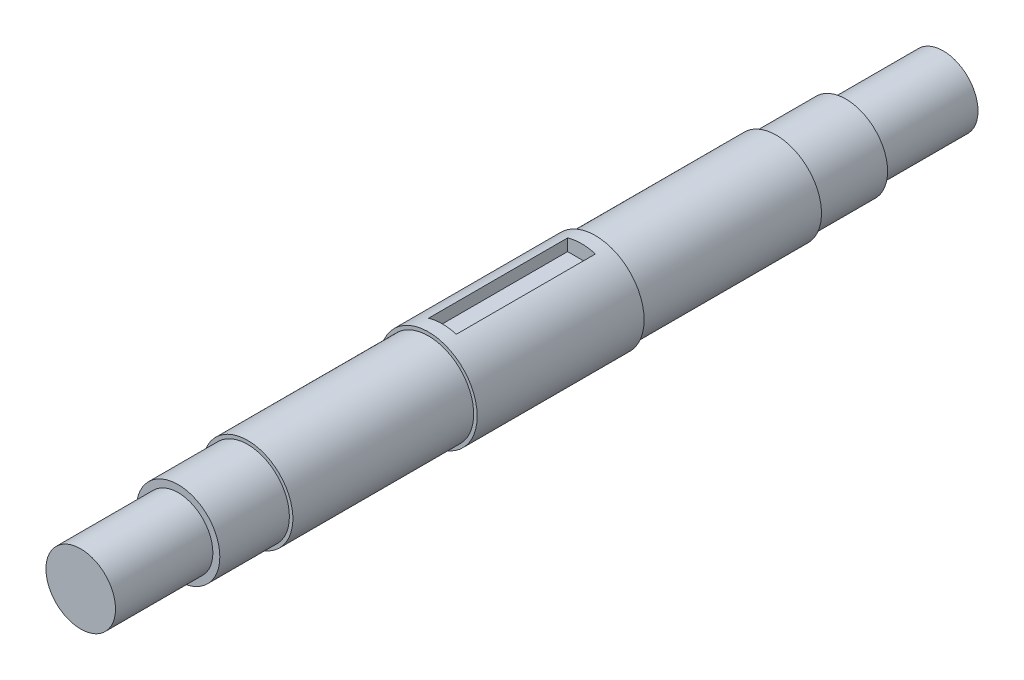
ISO-10303-21;
HEADER;
FILE_DESCRIPTION(('STEP AP214'),'2;1');
FILE_NAME('part.step','',(''),(''),'','','');
FILE_SCHEMA(('AUTOMOTIVE_DESIGN { 1 0 10303 214 1 1 1 1 }'));
ENDSEC;
DATA;
#1=APPLICATION_CONTEXT('core data for automotive mechanical design processes');
#2=APPLICATION_PROTOCOL_DEFINITION('international standard','automotive_design',2000,#1);
#3=PRODUCT_CONTEXT('',#1,'mechanical');
#4=PRODUCT('Part','Part','',(#3));
#5=PRODUCT_RELATED_PRODUCT_CATEGORY('part','',(#4));
#6=PRODUCT_DEFINITION_FORMATION('','',#4);
#7=PRODUCT_DEFINITION_CONTEXT('part definition',#1,'design');
#8=PRODUCT_DEFINITION('design','',#6,#7);
#9=PRODUCT_DEFINITION_SHAPE('','',#8);
#10=(LENGTH_UNIT() NAMED_UNIT(*) SI_UNIT(.MILLI.,.METRE.));
#11=(NAMED_UNIT(*) PLANE_ANGLE_UNIT() SI_UNIT($,.RADIAN.));
#12=(NAMED_UNIT(*) SI_UNIT($,.STERADIAN.) SOLID_ANGLE_UNIT());
#13=UNCERTAINTY_MEASURE_WITH_UNIT(LENGTH_MEASURE(1.E-05),#10,'distance_accuracy_value','');
#14=(GEOMETRIC_REPRESENTATION_CONTEXT(3) GLOBAL_UNCERTAINTY_ASSIGNED_CONTEXT((#13)) GLOBAL_UNIT_ASSIGNED_CONTEXT((#10,
#11,#12)) REPRESENTATION_CONTEXT('',''));
#15=CARTESIAN_POINT('',(0.,0.,0.));
#16=DIRECTION('',(0.,0.,1.));
#17=DIRECTION('',(1.,0.,0.));
#18=AXIS2_PLACEMENT_3D('',#15,#16,#17);
#19=CARTESIAN_POINT('',(0.,0.,14.));
#20=DIRECTION('',(0.,0.,-1.));
#21=DIRECTION('',(-1.,0.,0.));
#22=AXIS2_PLACEMENT_3D('',#19,#20,#21);
#23=CYLINDRICAL_SURFACE('',#22,5.);
#24=CARTESIAN_POINT('',(0.,0.,14.));
#25=DIRECTION('',(0.,0.,1.));
#26=DIRECTION('',(1.,0.,0.));
#27=AXIS2_PLACEMENT_3D('',#24,#25,#26);
#28=CIRCLE('',#27,5.);
#29=CARTESIAN_POINT('',(5.,0.,14.));
#30=VERTEX_POINT('',#29);
#31=EDGE_CURVE('E144',#30,#30,#28,.T.);
#32=ORIENTED_EDGE('',*,*,#31,.F.);
#33=EDGE_LOOP('',(#32));
#34=FACE_BOUND('',#33,.T.);
#35=CARTESIAN_POINT('',(0.,0.,0.));
#36=DIRECTION('',(0.,0.,1.));
#37=DIRECTION('',(1.,0.,0.));
#38=AXIS2_PLACEMENT_3D('',#35,#36,#37);
#39=CIRCLE('',#38,5.);
#40=CARTESIAN_POINT('',(5.,0.,0.));
#41=VERTEX_POINT('',#40);
#42=EDGE_CURVE('E142',#41,#41,#39,.T.);
#43=ORIENTED_EDGE('',*,*,#42,.T.);
#44=EDGE_LOOP('',(#43));
#45=FACE_BOUND('',#44,.T.);
#46=ADVANCED_FACE('F39',(#34,#45),#23,.T.);
#47=CARTESIAN_POINT('',(0.,0.,0.));
#48=DIRECTION('',(0.,0.,1.));
#49=DIRECTION('',(1.,0.,0.));
#50=AXIS2_PLACEMENT_3D('',#47,#48,#49);
#51=PLANE('',#50);
#52=ORIENTED_EDGE('',*,*,#42,.F.);
#53=EDGE_LOOP('',(#52));
#54=FACE_BOUND('',#53,.T.);
#55=ADVANCED_FACE('F166',(#54),#51,.F.);
#56=CARTESIAN_POINT('',(0.,0.,24.));
#57=DIRECTION('',(0.,0.,-1.));
#58=DIRECTION('',(-1.,0.,0.));
#59=AXIS2_PLACEMENT_3D('',#56,#57,#58);
#60=CYLINDRICAL_SURFACE('',#59,6.);
#61=CARTESIAN_POINT('',(0.,0.,24.));
#62=DIRECTION('',(0.,0.,1.));
#63=DIRECTION('',(1.,0.,0.));
#64=AXIS2_PLACEMENT_3D('',#61,#62,#63);
#65=CIRCLE('',#64,6.);
#66=CARTESIAN_POINT('',(6.,0.,24.));
#67=VERTEX_POINT('',#66);
#68=EDGE_CURVE('E136',#67,#67,#65,.T.);
#69=ORIENTED_EDGE('',*,*,#68,.F.);
#70=EDGE_LOOP('',(#69));
#71=FACE_BOUND('',#70,.T.);
#72=CARTESIAN_POINT('',(0.,0.,14.));
#73=DIRECTION('',(0.,0.,1.));
#74=DIRECTION('',(1.,0.,0.));
#75=AXIS2_PLACEMENT_3D('',#72,#73,#74);
#76=CIRCLE('',#75,6.);
#77=CARTESIAN_POINT('',(6.,0.,14.));
#78=VERTEX_POINT('',#77);
#79=EDGE_CURVE('E137',#78,#78,#76,.T.);
#80=ORIENTED_EDGE('',*,*,#79,.T.);
#81=EDGE_LOOP('',(#80));
#82=FACE_BOUND('',#81,.T.);
#83=ADVANCED_FACE('F174',(#71,#82),#60,.T.);
#84=CARTESIAN_POINT('',(0.,0.,14.));
#85=DIRECTION('',(0.,0.,1.));
#86=DIRECTION('',(1.,0.,0.));
#87=AXIS2_PLACEMENT_3D('',#84,#85,#86);
#88=PLANE('',#87);
#89=ORIENTED_EDGE('',*,*,#31,.T.);
#90=EDGE_LOOP('',(#89));
#91=FACE_BOUND('',#90,.T.);
#92=ORIENTED_EDGE('',*,*,#79,.F.);
#93=EDGE_LOOP('',(#92));
#94=FACE_BOUND('',#93,.T.);
#95=ADVANCED_FACE('F182',(#91,#94),#88,.F.);
#96=CARTESIAN_POINT('',(0.,0.,50.));
#97=DIRECTION('',(0.,0.,-1.));
#98=DIRECTION('',(-1.,0.,0.));
#99=AXIS2_PLACEMENT_3D('',#96,#97,#98);
#100=CYLINDRICAL_SURFACE('',#99,6.5);
#101=CARTESIAN_POINT('',(0.,0.,50.));
#102=DIRECTION('',(0.,0.,1.));
#103=DIRECTION('',(1.,0.,0.));
#104=AXIS2_PLACEMENT_3D('',#101,#102,#103);
#105=CIRCLE('',#104,6.5);
#106=CARTESIAN_POINT('',(-6.5,0.,50.));
#107=VERTEX_POINT('',#106);
#108=EDGE_CURVE('E131',#107,#107,#105,.T.);
#109=CARTESIAN_POINT('',(0.,0.,24.));
#110=DIRECTION('',(0.,0.,1.));
#111=DIRECTION('',(1.,0.,0.));
#112=AXIS2_PLACEMENT_3D('',#109,#110,#111);
#113=CIRCLE('',#112,6.5);
#114=CARTESIAN_POINT('',(-6.5,0.,24.));
#115=VERTEX_POINT('',#114);
#116=EDGE_CURVE('E135',#115,#115,#113,.T.);
#117=CARTESIAN_POINT('',(-6.5,0.,50.));
#118=CARTESIAN_POINT('',(-6.5,0.,49.7291666666667));
#119=CARTESIAN_POINT('',(-6.5,0.,49.4583333333333));
#120=CARTESIAN_POINT('',(-6.5,0.,48.9166666666667));
#121=CARTESIAN_POINT('',(-6.5,0.,48.6458333333333));
#122=CARTESIAN_POINT('',(-6.5,0.,48.1041666666667));
#123=CARTESIAN_POINT('',(-6.5,0.,47.8333333333333));
#124=CARTESIAN_POINT('',(-6.5,0.,47.2916666666667));
#125=CARTESIAN_POINT('',(-6.5,0.,47.0208333333333));
#126=CARTESIAN_POINT('',(-6.5,0.,46.4791666666667));
#127=CARTESIAN_POINT('',(-6.5,0.,46.2083333333333));
#128=CARTESIAN_POINT('',(-6.5,0.,45.6666666666667));
#129=CARTESIAN_POINT('',(-6.5,0.,45.3958333333333));
#130=CARTESIAN_POINT('',(-6.5,0.,44.8541666666667));
#131=CARTESIAN_POINT('',(-6.5,0.,44.5833333333333));
#132=CARTESIAN_POINT('',(-6.5,0.,44.0416666666667));
#133=CARTESIAN_POINT('',(-6.5,0.,43.7708333333333));
#134=CARTESIAN_POINT('',(-6.5,0.,43.2291666666667));
#135=CARTESIAN_POINT('',(-6.5,0.,42.9583333333333));
#136=CARTESIAN_POINT('',(-6.5,0.,42.4166666666667));
#137=CARTESIAN_POINT('',(-6.5,0.,42.1458333333333));
#138=CARTESIAN_POINT('',(-6.5,0.,41.6041666666667));
#139=CARTESIAN_POINT('',(-6.5,0.,41.3333333333333));
#140=CARTESIAN_POINT('',(-6.5,0.,40.7916666666667));
#141=CARTESIAN_POINT('',(-6.5,0.,40.5208333333333));
#142=CARTESIAN_POINT('',(-6.5,0.,39.9791666666667));
#143=CARTESIAN_POINT('',(-6.5,0.,39.7083333333333));
#144=CARTESIAN_POINT('',(-6.5,0.,39.1666666666667));
#145=CARTESIAN_POINT('',(-6.5,0.,38.8958333333333));
#146=CARTESIAN_POINT('',(-6.5,0.,38.3541666666667));
#147=CARTESIAN_POINT('',(-6.5,0.,38.0833333333333));
#148=CARTESIAN_POINT('',(-6.5,0.,37.5416666666667));
#149=CARTESIAN_POINT('',(-6.5,0.,37.2708333333333));
#150=CARTESIAN_POINT('',(-6.5,0.,36.7291666666667));
#151=CARTESIAN_POINT('',(-6.5,0.,36.4583333333333));
#152=CARTESIAN_POINT('',(-6.5,0.,35.9166666666667));
#153=CARTESIAN_POINT('',(-6.5,0.,35.6458333333333));
#154=CARTESIAN_POINT('',(-6.5,0.,35.1041666666667));
#155=CARTESIAN_POINT('',(-6.5,0.,34.8333333333333));
#156=CARTESIAN_POINT('',(-6.5,0.,34.2916666666667));
#157=CARTESIAN_POINT('',(-6.5,0.,34.0208333333333));
#158=CARTESIAN_POINT('',(-6.5,0.,33.4791666666667));
#159=CARTESIAN_POINT('',(-6.5,0.,33.2083333333333));
#160=CARTESIAN_POINT('',(-6.5,0.,32.6666666666667));
#161=CARTESIAN_POINT('',(-6.5,0.,32.3958333333333));
#162=CARTESIAN_POINT('',(-6.5,0.,31.8541666666667));
#163=CARTESIAN_POINT('',(-6.5,0.,31.5833333333333));
#164=CARTESIAN_POINT('',(-6.5,0.,31.0416666666667));
#165=CARTESIAN_POINT('',(-6.5,0.,30.7708333333333));
#166=CARTESIAN_POINT('',(-6.5,0.,30.2291666666667));
#167=CARTESIAN_POINT('',(-6.5,0.,29.9583333333333));
#168=CARTESIAN_POINT('',(-6.5,0.,29.4166666666667));
#169=CARTESIAN_POINT('',(-6.5,0.,29.1458333333333));
#170=CARTESIAN_POINT('',(-6.5,0.,28.6041666666667));
#171=CARTESIAN_POINT('',(-6.5,0.,28.3333333333333));
#172=CARTESIAN_POINT('',(-6.5,0.,27.7916666666667));
#173=CARTESIAN_POINT('',(-6.5,0.,27.5208333333333));
#174=CARTESIAN_POINT('',(-6.5,0.,26.9791666666667));
#175=CARTESIAN_POINT('',(-6.5,0.,26.7083333333333));
#176=CARTESIAN_POINT('',(-6.5,0.,26.1666666666667));
#177=CARTESIAN_POINT('',(-6.5,0.,25.8958333333333));
#178=CARTESIAN_POINT('',(-6.5,0.,25.3541666666667));
#179=CARTESIAN_POINT('',(-6.5,0.,25.0833333333333));
#180=CARTESIAN_POINT('',(-6.5,0.,24.5416666666667));
#181=CARTESIAN_POINT('',(-6.5,0.,24.2708333333333));
#182=CARTESIAN_POINT('',(-6.5,0.,24.));
#183=B_SPLINE_CURVE_WITH_KNOTS('',3,(#117,#118,#119,#120,#121,#122,#123,#124,#125,#126,#127,
#128,#129,#130,#131,#132,#133,#134,#135,#136,#137,#138,#139,#140,#141,#142,#143,#144,#145,#146,
#147,#148,#149,#150,#151,#152,#153,#154,#155,#156,#157,#158,#159,#160,#161,#162,#163,#164,#165,
#166,#167,#168,#169,#170,#171,#172,#173,#174,#175,#176,#177,#178,#179,#180,#181,#182),
.UNSPECIFIED.,.F.,.F.,(4,2,2,2,2,2,2,2,2,2,2,2,2,2,2,2,2,2,2,2,2,2,2,2,2,2,2,2,2,2,2,2,4),(0.,
0.812499999999994,1.62499999999999,2.4375,3.25,4.0625,4.875,5.6875,6.5,7.3125,8.125,
8.93749999999999,9.74999999999999,10.5625,11.375,12.1875,13.,13.8125,14.625,15.4375,16.25,
17.0625,17.875,18.6875,19.5,20.3125,21.125,21.9375,22.75,23.5625,24.375,25.1875,26.),.UNSPECIFIED.);
#184=EDGE_CURVE('BSEAM184',#107,#115,#183,.T.);
#185=ORIENTED_EDGE('',*,*,#108,.F.);
#186=ORIENTED_EDGE('',*,*,#116,.T.);
#187=ORIENTED_EDGE('',*,*,#184,.T.);
#188=ORIENTED_EDGE('',*,*,#184,.F.);
#189=EDGE_LOOP('',(#185,#187,#186,#188));
#190=FACE_BOUND('',#189,.T.);
#191=ADVANCED_FACE('F184',(#190),#100,.T.);
#192=CARTESIAN_POINT('',(0.,0.,24.));
#193=DIRECTION('',(0.,0.,1.));
#194=DIRECTION('',(1.,0.,0.));
#195=AXIS2_PLACEMENT_3D('',#192,#193,#194);
#196=PLANE('',#195);
#197=ORIENTED_EDGE('',*,*,#68,.T.);
#198=EDGE_LOOP('',(#197));
#199=FACE_BOUND('',#198,.T.);
#200=ORIENTED_EDGE('',*,*,#116,.F.);
#201=EDGE_LOOP('',(#200));
#202=FACE_BOUND('',#201,.T.);
#203=ADVANCED_FACE('F197',(#199,#202),#196,.F.);
#204=CARTESIAN_POINT('',(0.,0.,62.));
#205=DIRECTION('',(0.,0.,-1.));
#206=DIRECTION('',(-1.,0.,0.));
#207=AXIS2_PLACEMENT_3D('',#204,#205,#206);
#208=CYLINDRICAL_SURFACE('',#207,7.);
#209=DIRECTION('',(0.,0.,-1.));
#210=VECTOR('',#209,1.);
#211=CARTESIAN_POINT('',(2.,6.70820393249937,62.));
#212=LINE('',#211,#210);
#213=CARTESIAN_POINT('',(2.,6.70820393249937,52.));
#214=VERTEX_POINT('',#213);
#215=CARTESIAN_POINT('',(2.,6.70820393249937,72.));
#216=VERTEX_POINT('',#215);
#217=EDGE_CURVE('E11',#214,#216,#212,.F.);
#218=ORIENTED_EDGE('',*,*,#217,.T.);
#219=CARTESIAN_POINT('',(0.,0.,72.));
#220=DIRECTION('',(0.,0.,1.));
#221=DIRECTION('',(1.,0.,0.));
#222=AXIS2_PLACEMENT_3D('',#219,#220,#221);
#223=CIRCLE('',#222,7.);
#224=CARTESIAN_POINT('',(-2.,6.70820393249937,72.));
#225=VERTEX_POINT('',#224);
#226=EDGE_CURVE('E146',#216,#225,#223,.T.);
#227=ORIENTED_EDGE('',*,*,#226,.T.);
#228=DIRECTION('',(0.,0.,-1.));
#229=VECTOR('',#228,1.);
#230=CARTESIAN_POINT('',(-2.,6.70820393249937,62.));
#231=LINE('',#230,#229);
#232=CARTESIAN_POINT('',(-2.,6.70820393249937,52.));
#233=VERTEX_POINT('',#232);
#234=EDGE_CURVE('E46',#225,#233,#231,.T.);
#235=ORIENTED_EDGE('',*,*,#234,.T.);
#236=CARTESIAN_POINT('',(0.,0.,52.));
#237=DIRECTION('',(0.,0.,-1.));
#238=DIRECTION('',(-1.,0.,0.));
#239=AXIS2_PLACEMENT_3D('',#236,#237,#238);
#240=CIRCLE('',#239,7.);
#241=EDGE_CURVE('E63',#233,#214,#240,.T.);
#242=ORIENTED_EDGE('',*,*,#241,.T.);
#243=EDGE_LOOP('',(#218,#227,#235,#242));
#244=FACE_BOUND('',#243,.T.);
#245=CARTESIAN_POINT('',(0.,0.,50.));
#246=DIRECTION('',(0.,0.,1.));
#247=DIRECTION('',(1.,0.,0.));
#248=AXIS2_PLACEMENT_3D('',#245,#246,#247);
#249=CIRCLE('',#248,7.);
#250=CARTESIAN_POINT('',(7.,0.,50.));
#251=VERTEX_POINT('',#250);
#252=EDGE_CURVE('E130',#251,#251,#249,.T.);
#253=ORIENTED_EDGE('',*,*,#252,.T.);
#254=EDGE_LOOP('',(#253));
#255=FACE_BOUND('',#254,.T.);
#256=CARTESIAN_POINT('',(0.,0.,74.));
#257=DIRECTION('',(0.,0.,1.));
#258=DIRECTION('',(1.,0.,0.));
#259=AXIS2_PLACEMENT_3D('',#256,#257,#258);
#260=CIRCLE('',#259,7.);
#261=CARTESIAN_POINT('',(7.,0.,74.));
#262=VERTEX_POINT('',#261);
#263=EDGE_CURVE('E104',#262,#262,#260,.T.);
#264=ORIENTED_EDGE('',*,*,#263,.F.);
#265=EDGE_LOOP('',(#264));
#266=FACE_BOUND('',#265,.T.);
#267=ADVANCED_FACE('F153',(#244,#255,#266),#208,.T.);
#268=CARTESIAN_POINT('',(0.,0.,50.));
#269=DIRECTION('',(0.,0.,1.));
#270=DIRECTION('',(1.,0.,0.));
#271=AXIS2_PLACEMENT_3D('',#268,#269,#270);
#272=PLANE('',#271);
#273=ORIENTED_EDGE('',*,*,#108,.T.);
#274=EDGE_LOOP('',(#273));
#275=FACE_BOUND('',#274,.T.);
#276=ORIENTED_EDGE('',*,*,#252,.F.);
#277=EDGE_LOOP('',(#276));
#278=FACE_BOUND('',#277,.T.);
#279=ADVANCED_FACE('F204',(#275,#278),#272,.F.);
#280=CARTESIAN_POINT('',(0.,0.,110.));
#281=DIRECTION('',(0.,0.,1.));
#282=DIRECTION('',(-1.,0.,0.));
#283=AXIS2_PLACEMENT_3D('',#280,#281,#282);
#284=CYLINDRICAL_SURFACE('',#283,5.);
#285=CARTESIAN_POINT('',(0.,0.,110.));
#286=DIRECTION('',(0.,0.,1.));
#287=DIRECTION('',(1.,0.,0.));
#288=AXIS2_PLACEMENT_3D('',#285,#286,#287);
#289=CIRCLE('',#288,5.);
#290=CARTESIAN_POINT('',(5.,0.,110.));
#291=VERTEX_POINT('',#290);
#292=EDGE_CURVE('E121',#291,#291,#289,.T.);
#293=ORIENTED_EDGE('',*,*,#292,.T.);
#294=EDGE_LOOP('',(#293));
#295=FACE_BOUND('',#294,.T.);
#296=CARTESIAN_POINT('',(0.,0.,124.));
#297=DIRECTION('',(0.,0.,1.));
#298=DIRECTION('',(1.,0.,0.));
#299=AXIS2_PLACEMENT_3D('',#296,#297,#298);
#300=CIRCLE('',#299,5.);
#301=CARTESIAN_POINT('',(5.,0.,124.));
#302=VERTEX_POINT('',#301);
#303=EDGE_CURVE('E122',#302,#302,#300,.T.);
#304=ORIENTED_EDGE('',*,*,#303,.F.);
#305=EDGE_LOOP('',(#304));
#306=FACE_BOUND('',#305,.T.);
#307=ADVANCED_FACE('F206',(#295,#306),#284,.T.);
#308=CARTESIAN_POINT('',(0.,0.,124.));
#309=DIRECTION('',(0.,0.,-1.));
#310=DIRECTION('',(1.,0.,0.));
#311=AXIS2_PLACEMENT_3D('',#308,#309,#310);
#312=PLANE('',#311);
#313=ORIENTED_EDGE('',*,*,#303,.T.);
#314=EDGE_LOOP('',(#313));
#315=FACE_BOUND('',#314,.T.);
#316=ADVANCED_FACE('F209',(#315),#312,.F.);
#317=CARTESIAN_POINT('',(0.,0.,100.));
#318=DIRECTION('',(0.,0.,1.));
#319=DIRECTION('',(-1.,0.,0.));
#320=AXIS2_PLACEMENT_3D('',#317,#318,#319);
#321=CYLINDRICAL_SURFACE('',#320,6.);
#322=CARTESIAN_POINT('',(0.,0.,100.));
#323=DIRECTION('',(0.,0.,1.));
#324=DIRECTION('',(1.,0.,0.));
#325=AXIS2_PLACEMENT_3D('',#322,#323,#324);
#326=CIRCLE('',#325,6.);
#327=CARTESIAN_POINT('',(6.,0.,100.));
#328=VERTEX_POINT('',#327);
#329=EDGE_CURVE('E116',#328,#328,#326,.T.);
#330=ORIENTED_EDGE('',*,*,#329,.T.);
#331=EDGE_LOOP('',(#330));
#332=FACE_BOUND('',#331,.T.);
#333=CARTESIAN_POINT('',(0.,0.,110.));
#334=DIRECTION('',(0.,0.,1.));
#335=DIRECTION('',(1.,0.,0.));
#336=AXIS2_PLACEMENT_3D('',#333,#334,#335);
#337=CIRCLE('',#336,6.);
#338=CARTESIAN_POINT('',(6.,0.,110.));
#339=VERTEX_POINT('',#338);
#340=EDGE_CURVE('E113',#339,#339,#337,.T.);
#341=ORIENTED_EDGE('',*,*,#340,.F.);
#342=EDGE_LOOP('',(#341));
#343=FACE_BOUND('',#342,.T.);
#344=ADVANCED_FACE('F212',(#332,#343),#321,.T.);
#345=CARTESIAN_POINT('',(0.,0.,110.));
#346=DIRECTION('',(0.,0.,-1.));
#347=DIRECTION('',(1.,0.,0.));
#348=AXIS2_PLACEMENT_3D('',#345,#346,#347);
#349=PLANE('',#348);
#350=ORIENTED_EDGE('',*,*,#292,.F.);
#351=EDGE_LOOP('',(#350));
#352=FACE_BOUND('',#351,.T.);
#353=ORIENTED_EDGE('',*,*,#340,.T.);
#354=EDGE_LOOP('',(#353));
#355=FACE_BOUND('',#354,.T.);
#356=ADVANCED_FACE('F217',(#352,#355),#349,.F.);
#357=CARTESIAN_POINT('',(0.,0.,74.));
#358=DIRECTION('',(0.,0.,1.));
#359=DIRECTION('',(-1.,0.,0.));
#360=AXIS2_PLACEMENT_3D('',#357,#358,#359);
#361=CYLINDRICAL_SURFACE('',#360,6.5);
#362=CARTESIAN_POINT('',(0.,0.,74.));
#363=DIRECTION('',(0.,0.,1.));
#364=DIRECTION('',(1.,0.,0.));
#365=AXIS2_PLACEMENT_3D('',#362,#363,#364);
#366=CIRCLE('',#365,6.5);
#367=CARTESIAN_POINT('',(-6.5,0.,74.));
#368=VERTEX_POINT('',#367);
#369=EDGE_CURVE('E115',#368,#368,#366,.T.);
#370=CARTESIAN_POINT('',(0.,0.,100.));
#371=DIRECTION('',(0.,0.,1.));
#372=DIRECTION('',(1.,0.,0.));
#373=AXIS2_PLACEMENT_3D('',#370,#371,#372);
#374=CIRCLE('',#373,6.5);
#375=CARTESIAN_POINT('',(-6.5,0.,100.));
#376=VERTEX_POINT('',#375);
#377=EDGE_CURVE('E112',#376,#376,#374,.T.);
#378=CARTESIAN_POINT('',(-6.5,0.,74.));
#379=CARTESIAN_POINT('',(-6.5,0.,74.2708333333333));
#380=CARTESIAN_POINT('',(-6.5,0.,74.5416666666667));
#381=CARTESIAN_POINT('',(-6.5,0.,75.0833333333333));
#382=CARTESIAN_POINT('',(-6.5,0.,75.3541666666667));
#383=CARTESIAN_POINT('',(-6.5,0.,75.8958333333333));
#384=CARTESIAN_POINT('',(-6.5,0.,76.1666666666667));
#385=CARTESIAN_POINT('',(-6.5,0.,76.7083333333333));
#386=CARTESIAN_POINT('',(-6.5,0.,76.9791666666667));
#387=CARTESIAN_POINT('',(-6.5,0.,77.5208333333333));
#388=CARTESIAN_POINT('',(-6.5,0.,77.7916666666667));
#389=CARTESIAN_POINT('',(-6.5,0.,78.3333333333333));
#390=CARTESIAN_POINT('',(-6.5,0.,78.6041666666667));
#391=CARTESIAN_POINT('',(-6.5,0.,79.1458333333333));
#392=CARTESIAN_POINT('',(-6.5,0.,79.4166666666667));
#393=CARTESIAN_POINT('',(-6.5,0.,79.9583333333333));
#394=CARTESIAN_POINT('',(-6.5,0.,80.2291666666667));
#395=CARTESIAN_POINT('',(-6.5,0.,80.7708333333333));
#396=CARTESIAN_POINT('',(-6.5,0.,81.0416666666667));
#397=CARTESIAN_POINT('',(-6.5,0.,81.5833333333333));
#398=CARTESIAN_POINT('',(-6.5,0.,81.8541666666667));
#399=CARTESIAN_POINT('',(-6.5,0.,82.3958333333333));
#400=CARTESIAN_POINT('',(-6.5,0.,82.6666666666667));
#401=CARTESIAN_POINT('',(-6.5,0.,83.2083333333333));
#402=CARTESIAN_POINT('',(-6.5,0.,83.4791666666667));
#403=CARTESIAN_POINT('',(-6.5,0.,84.0208333333333));
#404=CARTESIAN_POINT('',(-6.5,0.,84.2916666666667));
#405=CARTESIAN_POINT('',(-6.5,0.,84.8333333333333));
#406=CARTESIAN_POINT('',(-6.5,0.,85.1041666666667));
#407=CARTESIAN_POINT('',(-6.5,0.,85.6458333333333));
#408=CARTESIAN_POINT('',(-6.5,0.,85.9166666666667));
#409=CARTESIAN_POINT('',(-6.5,0.,86.4583333333333));
#410=CARTESIAN_POINT('',(-6.5,0.,86.7291666666667));
#411=CARTESIAN_POINT('',(-6.5,0.,87.2708333333333));
#412=CARTESIAN_POINT('',(-6.5,0.,87.5416666666667));
#413=CARTESIAN_POINT('',(-6.5,0.,88.0833333333333));
#414=CARTESIAN_POINT('',(-6.5,0.,88.3541666666667));
#415=CARTESIAN_POINT('',(-6.5,0.,88.8958333333333));
#416=CARTESIAN_POINT('',(-6.5,0.,89.1666666666667));
#417=CARTESIAN_POINT('',(-6.5,0.,89.7083333333333));
#418=CARTESIAN_POINT('',(-6.5,0.,89.9791666666667));
#419=CARTESIAN_POINT('',(-6.5,0.,90.5208333333333));
#420=CARTESIAN_POINT('',(-6.5,0.,90.7916666666667));
#421=CARTESIAN_POINT('',(-6.5,0.,91.3333333333333));
#422=CARTESIAN_POINT('',(-6.5,0.,91.6041666666667));
#423=CARTESIAN_POINT('',(-6.5,0.,92.1458333333333));
#424=CARTESIAN_POINT('',(-6.5,0.,92.4166666666667));
#425=CARTESIAN_POINT('',(-6.5,0.,92.9583333333333));
#426=CARTESIAN_POINT('',(-6.5,0.,93.2291666666667));
#427=CARTESIAN_POINT('',(-6.5,0.,93.7708333333333));
#428=CARTESIAN_POINT('',(-6.5,0.,94.0416666666667));
#429=CARTESIAN_POINT('',(-6.5,0.,94.5833333333333));
#430=CARTESIAN_POINT('',(-6.5,0.,94.8541666666667));
#431=CARTESIAN_POINT('',(-6.5,0.,95.3958333333333));
#432=CARTESIAN_POINT('',(-6.5,0.,95.6666666666667));
#433=CARTESIAN_POINT('',(-6.5,0.,96.2083333333333));
#434=CARTESIAN_POINT('',(-6.5,0.,96.4791666666667));
#435=CARTESIAN_POINT('',(-6.5,0.,97.0208333333333));
#436=CARTESIAN_POINT('',(-6.5,0.,97.2916666666667));
#437=CARTESIAN_POINT('',(-6.5,0.,97.8333333333333));
#438=CARTESIAN_POINT('',(-6.5,0.,98.1041666666667));
#439=CARTESIAN_POINT('',(-6.5,0.,98.6458333333333));
#440=CARTESIAN_POINT('',(-6.5,0.,98.9166666666667));
#441=CARTESIAN_POINT('',(-6.5,0.,99.4583333333333));
#442=CARTESIAN_POINT('',(-6.5,0.,99.7291666666667));
#443=CARTESIAN_POINT('',(-6.5,0.,100.));
#444=B_SPLINE_CURVE_WITH_KNOTS('',3,(#378,#379,#380,#381,#382,#383,#384,#385,#386,#387,#388,
#389,#390,#391,#392,#393,#394,#395,#396,#397,#398,#399,#400,#401,#402,#403,#404,#405,#406,#407,
#408,#409,#410,#411,#412,#413,#414,#415,#416,#417,#418,#419,#420,#421,#422,#423,#424,#425,#426,
#427,#428,#429,#430,#431,#432,#433,#434,#435,#436,#437,#438,#439,#440,#441,#442,#443),
.UNSPECIFIED.,.F.,.F.,(4,2,2,2,2,2,2,2,2,2,2,2,2,2,2,2,2,2,2,2,2,2,2,2,2,2,2,2,2,2,2,2,4),(0.,
0.812500000000008,1.625,2.43750000000001,3.25,4.06250000000001,4.875,5.68750000000001,
6.50000000000001,7.31250000000001,8.12500000000001,8.93750000000001,9.75000000000001,10.5625,
11.375,12.1875,13.,13.8125,14.625,15.4375,16.25,17.0625,17.875,18.6875,19.5,20.3125,21.125,
21.9375,22.75,23.5625,24.375,25.1875,26.),.UNSPECIFIED.);
#445=EDGE_CURVE('BSEAM225',#368,#376,#444,.T.);
#446=ORIENTED_EDGE('',*,*,#369,.T.);
#447=ORIENTED_EDGE('',*,*,#377,.F.);
#448=ORIENTED_EDGE('',*,*,#445,.T.);
#449=ORIENTED_EDGE('',*,*,#445,.F.);
#450=EDGE_LOOP('',(#446,#448,#447,#449));
#451=FACE_BOUND('',#450,.T.);
#452=ADVANCED_FACE('F225',(#451),#361,.T.);
#453=CARTESIAN_POINT('',(0.,0.,100.));
#454=DIRECTION('',(0.,0.,-1.));
#455=DIRECTION('',(1.,0.,0.));
#456=AXIS2_PLACEMENT_3D('',#453,#454,#455);
#457=PLANE('',#456);
#458=ORIENTED_EDGE('',*,*,#329,.F.);
#459=EDGE_LOOP('',(#458));
#460=FACE_BOUND('',#459,.T.);
#461=ORIENTED_EDGE('',*,*,#377,.T.);
#462=EDGE_LOOP('',(#461));
#463=FACE_BOUND('',#462,.T.);
#464=ADVANCED_FACE('F228',(#460,#463),#457,.F.);
#465=CARTESIAN_POINT('',(0.,0.,74.));
#466=DIRECTION('',(0.,0.,-1.));
#467=DIRECTION('',(1.,0.,0.));
#468=AXIS2_PLACEMENT_3D('',#465,#466,#467);
#469=PLANE('',#468);
#470=ORIENTED_EDGE('',*,*,#369,.F.);
#471=EDGE_LOOP('',(#470));
#472=FACE_BOUND('',#471,.T.);
#473=ORIENTED_EDGE('',*,*,#263,.T.);
#474=EDGE_LOOP('',(#473));
#475=FACE_BOUND('',#474,.T.);
#476=ADVANCED_FACE('F164',(#472,#475),#469,.F.);
#477=CARTESIAN_POINT('',(-2.,5.,72.));
#478=DIRECTION('',(-1.,0.,0.));
#479=DIRECTION('',(0.,0.,1.));
#480=AXIS2_PLACEMENT_3D('',#477,#478,#479);
#481=PLANE('',#480);
#482=DIRECTION('',(0.,1.,0.));
#483=VECTOR('',#482,1.);
#484=CARTESIAN_POINT('',(-2.,5.,72.));
#485=LINE('',#484,#483);
#486=CARTESIAN_POINT('',(-2.,5.,72.));
#487=VERTEX_POINT('',#486);
#488=EDGE_CURVE('E52',#487,#225,#485,.T.);
#489=ORIENTED_EDGE('',*,*,#488,.F.);
#490=DIRECTION('',(0.,0.,1.));
#491=VECTOR('',#490,1.);
#492=CARTESIAN_POINT('',(-2.,5.,72.));
#493=LINE('',#492,#491);
#494=CARTESIAN_POINT('',(-2.,5.,52.));
#495=VERTEX_POINT('',#494);
#496=EDGE_CURVE('E82',#495,#487,#493,.T.);
#497=ORIENTED_EDGE('',*,*,#496,.F.);
#498=DIRECTION('',(0.,1.,0.));
#499=VECTOR('',#498,1.);
#500=CARTESIAN_POINT('',(-2.,5.,52.));
#501=LINE('',#500,#499);
#502=EDGE_CURVE('E103',#495,#233,#501,.T.);
#503=ORIENTED_EDGE('',*,*,#502,.T.);
#504=ORIENTED_EDGE('',*,*,#234,.F.);
#505=EDGE_LOOP('',(#489,#497,#503,#504));
#506=FACE_BOUND('',#505,.T.);
#507=ADVANCED_FACE('F77',(#506),#481,.F.);
#508=CARTESIAN_POINT('',(2.,5.,52.));
#509=DIRECTION('',(0.,0.,-1.));
#510=DIRECTION('',(-1.,0.,0.));
#511=AXIS2_PLACEMENT_3D('',#508,#509,#510);
#512=PLANE('',#511);
#513=ORIENTED_EDGE('',*,*,#502,.F.);
#514=DIRECTION('',(-1.,0.,0.));
#515=VECTOR('',#514,1.);
#516=CARTESIAN_POINT('',(2.,5.,52.));
#517=LINE('',#516,#515);
#518=CARTESIAN_POINT('',(2.,5.,52.));
#519=VERTEX_POINT('',#518);
#520=EDGE_CURVE('E88',#519,#495,#517,.T.);
#521=ORIENTED_EDGE('',*,*,#520,.F.);
#522=DIRECTION('',(0.,1.,0.));
#523=VECTOR('',#522,1.);
#524=CARTESIAN_POINT('',(2.,5.,52.));
#525=LINE('',#524,#523);
#526=EDGE_CURVE('E106',#519,#214,#525,.T.);
#527=ORIENTED_EDGE('',*,*,#526,.T.);
#528=ORIENTED_EDGE('',*,*,#241,.F.);
#529=EDGE_LOOP('',(#513,#521,#527,#528));
#530=FACE_BOUND('',#529,.T.);
#531=ADVANCED_FACE('F160',(#530),#512,.F.);
#532=CARTESIAN_POINT('',(2.,5.,72.));
#533=DIRECTION('',(1.,0.,0.));
#534=DIRECTION('',(0.,0.,-1.));
#535=AXIS2_PLACEMENT_3D('',#532,#533,#534);
#536=PLANE('',#535);
#537=ORIENTED_EDGE('',*,*,#526,.F.);
#538=DIRECTION('',(0.,0.,-1.));
#539=VECTOR('',#538,1.);
#540=CARTESIAN_POINT('',(2.,5.,72.));
#541=LINE('',#540,#539);
#542=CARTESIAN_POINT('',(2.,5.,72.));
#543=VERTEX_POINT('',#542);
#544=EDGE_CURVE('E92',#543,#519,#541,.T.);
#545=ORIENTED_EDGE('',*,*,#544,.F.);
#546=DIRECTION('',(0.,1.,0.));
#547=VECTOR('',#546,1.);
#548=CARTESIAN_POINT('',(2.,5.,72.));
#549=LINE('',#548,#547);
#550=EDGE_CURVE('E83',#543,#216,#549,.T.);
#551=ORIENTED_EDGE('',*,*,#550,.T.);
#552=ORIENTED_EDGE('',*,*,#217,.F.);
#553=EDGE_LOOP('',(#537,#545,#551,#552));
#554=FACE_BOUND('',#553,.T.);
#555=ADVANCED_FACE('F156',(#554),#536,.F.);
#556=CARTESIAN_POINT('',(2.,5.,72.));
#557=DIRECTION('',(0.,0.,1.));
#558=DIRECTION('',(1.,0.,0.));
#559=AXIS2_PLACEMENT_3D('',#556,#557,#558);
#560=PLANE('',#559);
#561=ORIENTED_EDGE('',*,*,#550,.F.);
#562=DIRECTION('',(1.,0.,0.));
#563=VECTOR('',#562,1.);
#564=CARTESIAN_POINT('',(2.,5.,72.));
#565=LINE('',#564,#563);
#566=EDGE_CURVE('E90',#487,#543,#565,.T.);
#567=ORIENTED_EDGE('',*,*,#566,.F.);
#568=ORIENTED_EDGE('',*,*,#488,.T.);
#569=ORIENTED_EDGE('',*,*,#226,.F.);
#570=EDGE_LOOP('',(#561,#567,#568,#569));
#571=FACE_BOUND('',#570,.T.);
#572=ADVANCED_FACE('F89',(#571),#560,.F.);
#573=CARTESIAN_POINT('',(0.,5.,0.));
#574=DIRECTION('',(0.,1.,0.));
#575=DIRECTION('',(0.,0.,1.));
#576=AXIS2_PLACEMENT_3D('',#573,#574,#575);
#577=PLANE('',#576);
#578=ORIENTED_EDGE('',*,*,#496,.T.);
#579=ORIENTED_EDGE('',*,*,#566,.T.);
#580=ORIENTED_EDGE('',*,*,#544,.T.);
#581=ORIENTED_EDGE('',*,*,#520,.T.);
#582=EDGE_LOOP('',(#578,#579,#580,#581));
#583=FACE_BOUND('',#582,.T.);
#584=ADVANCED_FACE('F100',(#583),#577,.T.);
#585=CLOSED_SHELL('',(#46,#55,#83,#95,#191,#203,#267,#279,#307,#316,#344,#356,#452,#464,#476,
#507,#531,#555,#572,#584));
#586=MANIFOLD_SOLID_BREP('B2',#585);
#587=ADVANCED_BREP_SHAPE_REPRESENTATION('',(#18,#586),#14);
#588=SHAPE_DEFINITION_REPRESENTATION(#9,#587);
ENDSEC;
END-ISO-10303-21;
